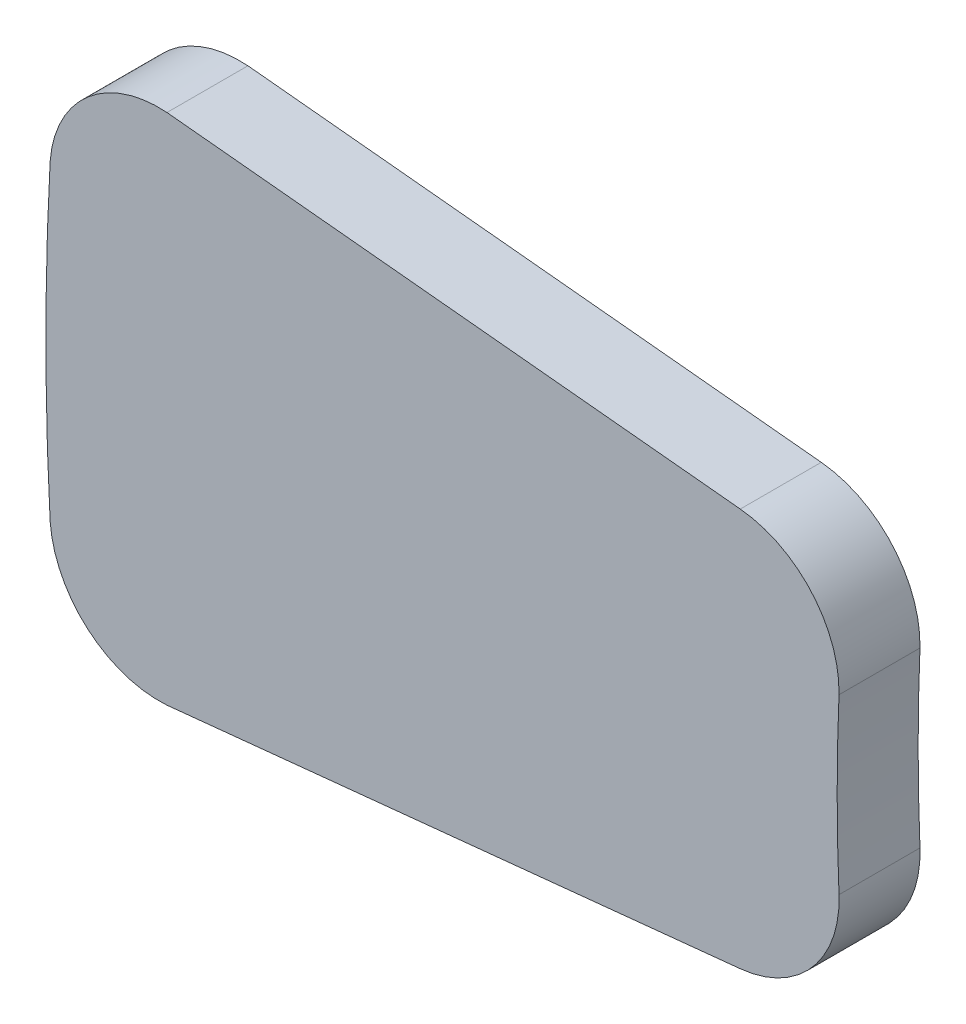
ISO-10303-21;
HEADER;
FILE_DESCRIPTION(('STEP AP214'),'2;1');
FILE_NAME('part.step','',(''),(''),'','','');
FILE_SCHEMA(('AUTOMOTIVE_DESIGN { 1 0 10303 214 1 1 1 1 }'));
ENDSEC;
DATA;
#1=APPLICATION_CONTEXT('core data for automotive mechanical design processes');
#2=APPLICATION_PROTOCOL_DEFINITION('international standard','automotive_design',2000,#1);
#3=PRODUCT_CONTEXT('',#1,'mechanical');
#4=PRODUCT('Part','Part','',(#3));
#5=PRODUCT_RELATED_PRODUCT_CATEGORY('part','',(#4));
#6=PRODUCT_DEFINITION_FORMATION('','',#4);
#7=PRODUCT_DEFINITION_CONTEXT('part definition',#1,'design');
#8=PRODUCT_DEFINITION('design','',#6,#7);
#9=PRODUCT_DEFINITION_SHAPE('','',#8);
#10=(LENGTH_UNIT() NAMED_UNIT(*) SI_UNIT(.MILLI.,.METRE.));
#11=(NAMED_UNIT(*) PLANE_ANGLE_UNIT() SI_UNIT($,.RADIAN.));
#12=(NAMED_UNIT(*) SI_UNIT($,.STERADIAN.) SOLID_ANGLE_UNIT());
#13=UNCERTAINTY_MEASURE_WITH_UNIT(LENGTH_MEASURE(1.E-05),#10,'distance_accuracy_value','');
#14=(GEOMETRIC_REPRESENTATION_CONTEXT(3) GLOBAL_UNCERTAINTY_ASSIGNED_CONTEXT((#13)) GLOBAL_UNIT_ASSIGNED_CONTEXT((#10,
#11,#12)) REPRESENTATION_CONTEXT('',''));
#15=CARTESIAN_POINT('',(0.,0.,0.));
#16=DIRECTION('',(0.,0.,1.));
#17=DIRECTION('',(1.,0.,0.));
#18=AXIS2_PLACEMENT_3D('',#15,#16,#17);
#19=CARTESIAN_POINT('',(0.,0.,0.05));
#20=DIRECTION('',(0.,0.,1.));
#21=DIRECTION('',(1.,0.,0.));
#22=AXIS2_PLACEMENT_3D('',#19,#20,#21);
#23=PLANE('',#22);
#24=CARTESIAN_POINT('',(-0.001116639412885,0.234442,0.05));
#25=DIRECTION('',(0.,0.,1.));
#26=DIRECTION('',(1.,0.,0.));
#27=AXIS2_PLACEMENT_3D('',#24,#25,#26);
#28=CIRCLE('',#27,1.755662529267);
#29=CARTESIAN_POINT('',(-1.75412399999946,0.13792199999236,0.05));
#30=VERTEX_POINT('',#29);
#31=CARTESIAN_POINT('',(-1.75412399999919,0.330962000012686,0.05));
#32=VERTEX_POINT('',#31);
#33=EDGE_CURVE('E91',#30,#32,#28,.F.);
#34=ORIENTED_EDGE('',*,*,#33,.F.);
#35=CARTESIAN_POINT('',(-1.68677543802,0.1433425229606,0.05));
#36=DIRECTION('',(0.,0.,1.));
#37=DIRECTION('',(1.,0.,0.));
#38=AXIS2_PLACEMENT_3D('',#35,#36,#37);
#39=CIRCLE('',#38,0.06756634421054);
#40=CARTESIAN_POINT('',(-1.68198800000038,0.0759459999999613,0.05));
#41=VERTEX_POINT('',#40);
#42=EDGE_CURVE('E20',#41,#30,#39,.F.);
#43=ORIENTED_EDGE('',*,*,#42,.F.);
#44=DIRECTION('',(0.9948517779548,0.1013407119581,0.));
#45=VECTOR('',#44,1.);
#46=CARTESIAN_POINT('',(-1.681988,0.075946,0.05));
#47=LINE('',#46,#45);
#48=CARTESIAN_POINT('',(-1.327912,0.112013999999998,0.05));
#49=VERTEX_POINT('',#48);
#50=EDGE_CURVE('E78',#49,#41,#47,.F.);
#51=ORIENTED_EDGE('',*,*,#50,.F.);
#52=CARTESIAN_POINT('',(-1.334688318832,0.1794627989846,0.05));
#53=DIRECTION('',(0.,0.,1.));
#54=DIRECTION('',(1.,0.,0.));
#55=AXIS2_PLACEMENT_3D('',#52,#53,#54);
#56=CIRCLE('',#55,0.06778833956794);
#57=CARTESIAN_POINT('',(-1.26695200000007,0.182117999999997,0.05));
#58=VERTEX_POINT('',#57);
#59=EDGE_CURVE('E98',#58,#49,#56,.F.);
#60=ORIENTED_EDGE('',*,*,#59,.F.);
#61=CARTESIAN_POINT('',(-0.0011860218114,0.235585,0.05));
#62=DIRECTION('',(0.,0.,1.));
#63=DIRECTION('',(1.,0.,0.));
#64=AXIS2_PLACEMENT_3D('',#61,#62,#63);
#65=CIRCLE('',#64,1.266894720026);
#66=CARTESIAN_POINT('',(-1.266952,0.28905200000664,0.05));
#67=VERTEX_POINT('',#66);
#68=EDGE_CURVE('E128',#58,#67,#65,.F.);
#69=ORIENTED_EDGE('',*,*,#68,.T.);
#70=CARTESIAN_POINT('',(-1.334444374285,0.2906905135485,0.05));
#71=DIRECTION('',(0.,0.,1.));
#72=DIRECTION('',(1.,0.,0.));
#73=AXIS2_PLACEMENT_3D('',#70,#71,#72);
#74=CIRCLE('',#73,0.06751226046618);
#75=CARTESIAN_POINT('',(-1.327912,0.357886,0.05));
#76=VERTEX_POINT('',#75);
#77=EDGE_CURVE('E126',#76,#67,#74,.F.);
#78=ORIENTED_EDGE('',*,*,#77,.F.);
#79=DIRECTION('',(-0.995135650553341,0.0985141461810341,0.));
#80=VECTOR('',#79,1.);
#81=CARTESIAN_POINT('',(-1.327912,0.357886,0.05));
#82=LINE('',#81,#80);
#83=CARTESIAN_POINT('',(-1.68198799999952,0.392937999999939,0.05));
#84=VERTEX_POINT('',#83);
#85=EDGE_CURVE('E103',#84,#76,#82,.F.);
#86=ORIENTED_EDGE('',*,*,#85,.F.);
#87=CARTESIAN_POINT('',(-1.686890004982,0.3256748254703,0.05));
#88=DIRECTION('',(0.,0.,1.));
#89=DIRECTION('',(1.,0.,0.));
#90=AXIS2_PLACEMENT_3D('',#87,#88,#89);
#91=CIRCLE('',#90,0.06744156211605);
#92=EDGE_CURVE('E123',#32,#84,#91,.F.);
#93=ORIENTED_EDGE('',*,*,#92,.F.);
#94=EDGE_LOOP('',(#34,#43,#51,#60,#69,#78,#86,#93));
#95=FACE_BOUND('',#94,.T.);
#96=ADVANCED_FACE('F17',(#95),#23,.T.);
#97=CARTESIAN_POINT('',(-1.68677543802,0.1433425229606,0.));
#98=DIRECTION('',(0.,0.,1.));
#99=DIRECTION('',(1.,0.,0.));
#100=AXIS2_PLACEMENT_3D('',#97,#98,#99);
#101=CYLINDRICAL_SURFACE('',#100,0.06756634421054);
#102=DIRECTION('',(0.,0.,1.));
#103=VECTOR('',#102,1.);
#104=CARTESIAN_POINT('',(-1.75412399999989,0.137922000000007,0.));
#105=LINE('',#104,#103);
#106=CARTESIAN_POINT('',(-1.75412399999946,0.13792199999236,0.));
#107=VERTEX_POINT('',#106);
#108=EDGE_CURVE('E122',#107,#30,#105,.T.);
#109=ORIENTED_EDGE('',*,*,#108,.F.);
#110=CARTESIAN_POINT('',(-1.68677543802,0.1433425229606,0.));
#111=DIRECTION('',(0.,0.,1.));
#112=DIRECTION('',(1.,0.,0.));
#113=AXIS2_PLACEMENT_3D('',#110,#111,#112);
#114=CIRCLE('',#113,0.06756634421054);
#115=CARTESIAN_POINT('',(-1.68198800000038,0.0759459999999614,0.));
#116=VERTEX_POINT('',#115);
#117=EDGE_CURVE('E97',#107,#116,#114,.T.);
#118=ORIENTED_EDGE('',*,*,#117,.T.);
#119=DIRECTION('',(0.,0.,1.));
#120=VECTOR('',#119,1.);
#121=CARTESIAN_POINT('',(-1.681988,0.075946,0.));
#122=LINE('',#121,#120);
#123=EDGE_CURVE('E83',#41,#116,#122,.F.);
#124=ORIENTED_EDGE('',*,*,#123,.F.);
#125=ORIENTED_EDGE('',*,*,#42,.T.);
#126=EDGE_LOOP('',(#109,#118,#124,#125));
#127=FACE_BOUND('',#126,.T.);
#128=ADVANCED_FACE('F96',(#127),#101,.T.);
#129=CARTESIAN_POINT('',(-1.681988,0.075946,0.));
#130=DIRECTION('',(0.1013407119581,-0.9948517779548,0.));
#131=DIRECTION('',(0.9948517779548,0.1013407119581,0.));
#132=AXIS2_PLACEMENT_3D('',#129,#130,#131);
#133=PLANE('',#132);
#134=ORIENTED_EDGE('',*,*,#123,.T.);
#135=DIRECTION('',(0.9948517779548,0.101340711958093,0.));
#136=VECTOR('',#135,1.);
#137=CARTESIAN_POINT('',(-1.681988,0.075946,0.));
#138=LINE('',#137,#136);
#139=CARTESIAN_POINT('',(-1.327912,0.112013999999998,0.));
#140=VERTEX_POINT('',#139);
#141=EDGE_CURVE('E119',#116,#140,#138,.T.);
#142=ORIENTED_EDGE('',*,*,#141,.T.);
#143=DIRECTION('',(0.,0.,1.));
#144=VECTOR('',#143,1.);
#145=CARTESIAN_POINT('',(-1.327912,0.112013999999997,0.));
#146=LINE('',#145,#144);
#147=EDGE_CURVE('E85',#49,#140,#146,.F.);
#148=ORIENTED_EDGE('',*,*,#147,.F.);
#149=ORIENTED_EDGE('',*,*,#50,.T.);
#150=EDGE_LOOP('',(#134,#142,#148,#149));
#151=FACE_BOUND('',#150,.T.);
#152=ADVANCED_FACE('F80',(#151),#133,.T.);
#153=CARTESIAN_POINT('',(-1.334688318832,0.1794627989846,0.));
#154=DIRECTION('',(0.,0.,1.));
#155=DIRECTION('',(1.,0.,0.));
#156=AXIS2_PLACEMENT_3D('',#153,#154,#155);
#157=CYLINDRICAL_SURFACE('',#156,0.06778833956794);
#158=ORIENTED_EDGE('',*,*,#147,.T.);
#159=CARTESIAN_POINT('',(-1.334688318832,0.1794627989846,0.));
#160=DIRECTION('',(0.,0.,1.));
#161=DIRECTION('',(1.,0.,0.));
#162=AXIS2_PLACEMENT_3D('',#159,#160,#161);
#163=CIRCLE('',#162,0.06778833956794);
#164=CARTESIAN_POINT('',(-1.2669520000004,0.182117999999984,0.));
#165=VERTEX_POINT('',#164);
#166=EDGE_CURVE('E116',#140,#165,#163,.T.);
#167=ORIENTED_EDGE('',*,*,#166,.T.);
#168=DIRECTION('',(0.,0.,1.));
#169=VECTOR('',#168,1.);
#170=CARTESIAN_POINT('',(-1.2669520000004,0.182117999999983,0.));
#171=LINE('',#170,#169);
#172=EDGE_CURVE('E130',#165,#58,#171,.T.);
#173=ORIENTED_EDGE('',*,*,#172,.T.);
#174=ORIENTED_EDGE('',*,*,#59,.T.);
#175=EDGE_LOOP('',(#158,#167,#173,#174));
#176=FACE_BOUND('',#175,.T.);
#177=ADVANCED_FACE('F159',(#176),#157,.T.);
#178=CARTESIAN_POINT('',(-0.0011860218114,0.235585,0.));
#179=DIRECTION('',(0.,0.,1.));
#180=DIRECTION('',(1.,0.,0.));
#181=AXIS2_PLACEMENT_3D('',#178,#179,#180);
#182=CYLINDRICAL_SURFACE('',#181,1.266894720026);
#183=ORIENTED_EDGE('',*,*,#68,.F.);
#184=ORIENTED_EDGE('',*,*,#172,.F.);
#185=CARTESIAN_POINT('',(-0.0011860218114,0.235585,0.));
#186=DIRECTION('',(0.,0.,1.));
#187=DIRECTION('',(1.,0.,0.));
#188=AXIS2_PLACEMENT_3D('',#185,#186,#187);
#189=CIRCLE('',#188,1.266894720026);
#190=CARTESIAN_POINT('',(-1.266952,0.28905200000664,0.));
#191=VERTEX_POINT('',#190);
#192=EDGE_CURVE('E113',#165,#191,#189,.F.);
#193=ORIENTED_EDGE('',*,*,#192,.T.);
#194=DIRECTION('',(0.,0.,1.));
#195=VECTOR('',#194,1.);
#196=CARTESIAN_POINT('',(-1.26695200000016,0.289052000000004,0.));
#197=LINE('',#196,#195);
#198=EDGE_CURVE('E105',#67,#191,#197,.F.);
#199=ORIENTED_EDGE('',*,*,#198,.F.);
#200=EDGE_LOOP('',(#183,#184,#193,#199));
#201=FACE_BOUND('',#200,.T.);
#202=ADVANCED_FACE('F157',(#201),#182,.F.);
#203=CARTESIAN_POINT('',(-1.334444374285,0.2906905135485,0.));
#204=DIRECTION('',(0.,0.,1.));
#205=DIRECTION('',(1.,0.,0.));
#206=AXIS2_PLACEMENT_3D('',#203,#204,#205);
#207=CYLINDRICAL_SURFACE('',#206,0.06751226046618);
#208=ORIENTED_EDGE('',*,*,#198,.T.);
#209=CARTESIAN_POINT('',(-1.334444374285,0.2906905135485,0.));
#210=DIRECTION('',(0.,0.,1.));
#211=DIRECTION('',(1.,0.,0.));
#212=AXIS2_PLACEMENT_3D('',#209,#210,#211);
#213=CIRCLE('',#212,0.06751226046618);
#214=CARTESIAN_POINT('',(-1.327912,0.357886,0.));
#215=VERTEX_POINT('',#214);
#216=EDGE_CURVE('E110',#191,#215,#213,.T.);
#217=ORIENTED_EDGE('',*,*,#216,.T.);
#218=DIRECTION('',(0.,0.,1.));
#219=VECTOR('',#218,1.);
#220=CARTESIAN_POINT('',(-1.327912,0.357886,0.));
#221=LINE('',#220,#219);
#222=EDGE_CURVE('E104',#76,#215,#221,.F.);
#223=ORIENTED_EDGE('',*,*,#222,.F.);
#224=ORIENTED_EDGE('',*,*,#77,.T.);
#225=EDGE_LOOP('',(#208,#217,#223,#224));
#226=FACE_BOUND('',#225,.T.);
#227=ADVANCED_FACE('F155',(#226),#207,.T.);
#228=CARTESIAN_POINT('',(-1.327912,0.357886,0.));
#229=DIRECTION('',(0.0985141461810341,0.995135650553341,0.));
#230=DIRECTION('',(-0.995135650553341,0.0985141461810341,0.));
#231=AXIS2_PLACEMENT_3D('',#228,#229,#230);
#232=PLANE('',#231);
#233=ORIENTED_EDGE('',*,*,#222,.T.);
#234=DIRECTION('',(-0.995135650553341,0.0985141461810339,0.));
#235=VECTOR('',#234,1.);
#236=CARTESIAN_POINT('',(-1.327912,0.357886,0.));
#237=LINE('',#236,#235);
#238=CARTESIAN_POINT('',(-1.68198799999952,0.39293799999994,0.));
#239=VERTEX_POINT('',#238);
#240=EDGE_CURVE('E109',#215,#239,#237,.T.);
#241=ORIENTED_EDGE('',*,*,#240,.T.);
#242=DIRECTION('',(0.,0.,1.));
#243=VECTOR('',#242,1.);
#244=CARTESIAN_POINT('',(-1.681988,0.392937999999975,0.));
#245=LINE('',#244,#243);
#246=EDGE_CURVE('E125',#84,#239,#245,.F.);
#247=ORIENTED_EDGE('',*,*,#246,.F.);
#248=ORIENTED_EDGE('',*,*,#85,.T.);
#249=EDGE_LOOP('',(#233,#241,#247,#248));
#250=FACE_BOUND('',#249,.T.);
#251=ADVANCED_FACE('F147',(#250),#232,.T.);
#252=CARTESIAN_POINT('',(-1.686890004982,0.3256748254703,0.));
#253=DIRECTION('',(0.,0.,1.));
#254=DIRECTION('',(1.,0.,0.));
#255=AXIS2_PLACEMENT_3D('',#252,#253,#254);
#256=CYLINDRICAL_SURFACE('',#255,0.06744156211605);
#257=ORIENTED_EDGE('',*,*,#246,.T.);
#258=CARTESIAN_POINT('',(-1.686890004982,0.3256748254703,0.));
#259=DIRECTION('',(0.,0.,1.));
#260=DIRECTION('',(1.,0.,0.));
#261=AXIS2_PLACEMENT_3D('',#258,#259,#260);
#262=CIRCLE('',#261,0.06744156211605);
#263=CARTESIAN_POINT('',(-1.75412399999919,0.330962000012686,0.));
#264=VERTEX_POINT('',#263);
#265=EDGE_CURVE('E26',#239,#264,#262,.T.);
#266=ORIENTED_EDGE('',*,*,#265,.T.);
#267=DIRECTION('',(0.,0.,1.));
#268=VECTOR('',#267,1.);
#269=CARTESIAN_POINT('',(-1.75412399999989,0.330961999999994,0.));
#270=LINE('',#269,#268);
#271=EDGE_CURVE('E34',#32,#264,#270,.F.);
#272=ORIENTED_EDGE('',*,*,#271,.F.);
#273=ORIENTED_EDGE('',*,*,#92,.T.);
#274=EDGE_LOOP('',(#257,#266,#272,#273));
#275=FACE_BOUND('',#274,.T.);
#276=ADVANCED_FACE('F175',(#275),#256,.T.);
#277=CARTESIAN_POINT('',(-0.001116639412885,0.234442,0.));
#278=DIRECTION('',(0.,0.,1.));
#279=DIRECTION('',(1.,0.,0.));
#280=AXIS2_PLACEMENT_3D('',#277,#278,#279);
#281=CYLINDRICAL_SURFACE('',#280,1.755662529267);
#282=ORIENTED_EDGE('',*,*,#271,.T.);
#283=CARTESIAN_POINT('',(-0.001116639412885,0.234442,0.));
#284=DIRECTION('',(0.,0.,1.));
#285=DIRECTION('',(1.,0.,0.));
#286=AXIS2_PLACEMENT_3D('',#283,#284,#285);
#287=CIRCLE('',#286,1.755662529267);
#288=EDGE_CURVE('E11',#264,#107,#287,.T.);
#289=ORIENTED_EDGE('',*,*,#288,.T.);
#290=ORIENTED_EDGE('',*,*,#108,.T.);
#291=ORIENTED_EDGE('',*,*,#33,.T.);
#292=EDGE_LOOP('',(#282,#289,#290,#291));
#293=FACE_BOUND('',#292,.T.);
#294=ADVANCED_FACE('F170',(#293),#281,.T.);
#295=CARTESIAN_POINT('',(0.,0.,0.));
#296=DIRECTION('',(0.,0.,1.));
#297=DIRECTION('',(1.,0.,0.));
#298=AXIS2_PLACEMENT_3D('',#295,#296,#297);
#299=PLANE('',#298);
#300=ORIENTED_EDGE('',*,*,#265,.F.);
#301=ORIENTED_EDGE('',*,*,#240,.F.);
#302=ORIENTED_EDGE('',*,*,#216,.F.);
#303=ORIENTED_EDGE('',*,*,#192,.F.);
#304=ORIENTED_EDGE('',*,*,#166,.F.);
#305=ORIENTED_EDGE('',*,*,#141,.F.);
#306=ORIENTED_EDGE('',*,*,#117,.F.);
#307=ORIENTED_EDGE('',*,*,#288,.F.);
#308=EDGE_LOOP('',(#300,#301,#302,#303,#304,#305,#306,#307));
#309=FACE_BOUND('',#308,.T.);
#310=ADVANCED_FACE('F152',(#309),#299,.F.);
#311=CLOSED_SHELL('',(#96,#128,#152,#177,#202,#227,#251,#276,#294,#310));
#312=MANIFOLD_SOLID_BREP('B1',#311);
#313=ADVANCED_BREP_SHAPE_REPRESENTATION('',(#18,#312),#14);
#314=SHAPE_DEFINITION_REPRESENTATION(#9,#313);
ENDSEC;
END-ISO-10303-21;
